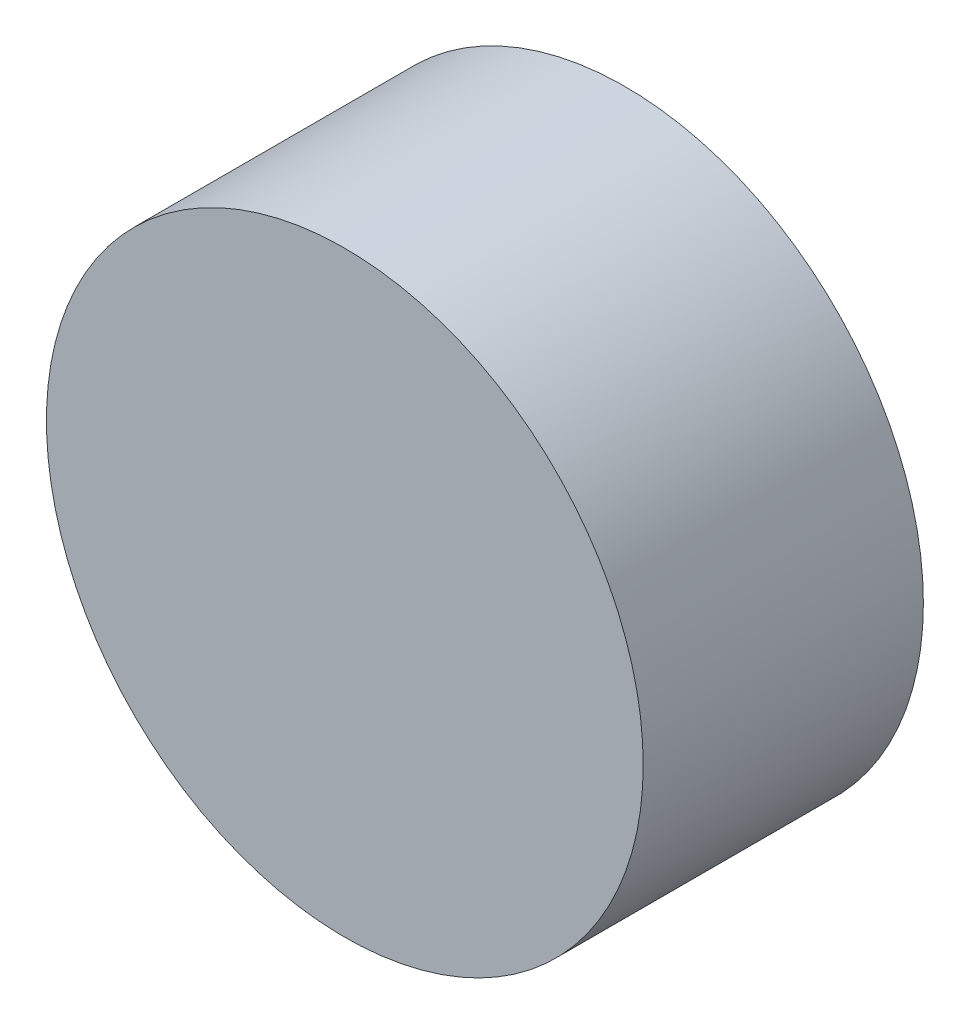
ISO-10303-21;
HEADER;
FILE_DESCRIPTION(('STEP AP214'),'2;1');
FILE_NAME('part.step','',(''),(''),'','','');
FILE_SCHEMA(('AUTOMOTIVE_DESIGN { 1 0 10303 214 1 1 1 1 }'));
ENDSEC;
DATA;
#1=APPLICATION_CONTEXT('core data for automotive mechanical design processes');
#2=APPLICATION_PROTOCOL_DEFINITION('international standard','automotive_design',2000,#1);
#3=PRODUCT_CONTEXT('',#1,'mechanical');
#4=PRODUCT('Part','Part','',(#3));
#5=PRODUCT_RELATED_PRODUCT_CATEGORY('part','',(#4));
#6=PRODUCT_DEFINITION_FORMATION('','',#4);
#7=PRODUCT_DEFINITION_CONTEXT('part definition',#1,'design');
#8=PRODUCT_DEFINITION('design','',#6,#7);
#9=PRODUCT_DEFINITION_SHAPE('','',#8);
#10=(LENGTH_UNIT() NAMED_UNIT(*) SI_UNIT(.MILLI.,.METRE.));
#11=(NAMED_UNIT(*) PLANE_ANGLE_UNIT() SI_UNIT($,.RADIAN.));
#12=(NAMED_UNIT(*) SI_UNIT($,.STERADIAN.) SOLID_ANGLE_UNIT());
#13=UNCERTAINTY_MEASURE_WITH_UNIT(LENGTH_MEASURE(1.E-05),#10,'distance_accuracy_value','');
#14=(GEOMETRIC_REPRESENTATION_CONTEXT(3) GLOBAL_UNCERTAINTY_ASSIGNED_CONTEXT((#13)) GLOBAL_UNIT_ASSIGNED_CONTEXT((#10,
#11,#12)) REPRESENTATION_CONTEXT('',''));
#15=CARTESIAN_POINT('',(0.,0.,0.));
#16=DIRECTION('',(0.,0.,1.));
#17=DIRECTION('',(1.,0.,0.));
#18=AXIS2_PLACEMENT_3D('',#15,#16,#17);
#19=CARTESIAN_POINT('',(0.,0.,48.75));
#20=DIRECTION('',(0.,0.,-1.));
#21=DIRECTION('',(-1.,0.,0.));
#22=AXIS2_PLACEMENT_3D('',#19,#20,#21);
#23=CYLINDRICAL_SURFACE('',#22,45.);
#24=CARTESIAN_POINT('',(0.,0.,6.5));
#25=DIRECTION('',(0.,0.,1.));
#26=DIRECTION('',(1.,0.,0.));
#27=AXIS2_PLACEMENT_3D('',#24,#25,#26);
#28=CIRCLE('',#27,45.);
#29=CARTESIAN_POINT('',(45.,0.,6.5));
#30=VERTEX_POINT('',#29);
#31=EDGE_CURVE('E69',#30,#30,#28,.T.);
#32=ORIENTED_EDGE('',*,*,#31,.T.);
#33=EDGE_LOOP('',(#32));
#34=FACE_BOUND('',#33,.T.);
#35=CARTESIAN_POINT('',(0.,0.,48.75));
#36=DIRECTION('',(0.,0.,1.));
#37=DIRECTION('',(1.,0.,0.));
#38=AXIS2_PLACEMENT_3D('',#35,#36,#37);
#39=CIRCLE('',#38,45.);
#40=CARTESIAN_POINT('',(45.,0.,48.75));
#41=VERTEX_POINT('',#40);
#42=EDGE_CURVE('E11',#41,#41,#39,.T.);
#43=ORIENTED_EDGE('',*,*,#42,.F.);
#44=EDGE_LOOP('',(#43));
#45=FACE_BOUND('',#44,.T.);
#46=ADVANCED_FACE('F63',(#34,#45),#23,.T.);
#47=CARTESIAN_POINT('',(0.,0.,48.75));
#48=DIRECTION('',(0.,0.,1.));
#49=DIRECTION('',(1.,0.,0.));
#50=AXIS2_PLACEMENT_3D('',#47,#48,#49);
#51=PLANE('',#50);
#52=ORIENTED_EDGE('',*,*,#42,.T.);
#53=EDGE_LOOP('',(#52));
#54=FACE_BOUND('',#53,.T.);
#55=ADVANCED_FACE('F134',(#54),#51,.T.);
#56=CARTESIAN_POINT('',(0.,0.,6.5));
#57=DIRECTION('',(0.,0.,-1.));
#58=DIRECTION('',(-1.,0.,0.));
#59=AXIS2_PLACEMENT_3D('',#56,#57,#58);
#60=CYLINDRICAL_SURFACE('',#59,31.5);
#61=CARTESIAN_POINT('',(0.,0.,6.5));
#62=DIRECTION('',(0.,0.,1.));
#63=DIRECTION('',(1.,0.,0.));
#64=AXIS2_PLACEMENT_3D('',#61,#62,#63);
#65=CIRCLE('',#64,31.5);
#66=CARTESIAN_POINT('',(-31.5,0.,6.5));
#67=VERTEX_POINT('',#66);
#68=EDGE_CURVE('E73',#67,#67,#65,.T.);
#69=CARTESIAN_POINT('',(0.,0.,0.));
#70=DIRECTION('',(0.,0.,1.));
#71=DIRECTION('',(1.,0.,0.));
#72=AXIS2_PLACEMENT_3D('',#69,#70,#71);
#73=CIRCLE('',#72,31.5);
#74=CARTESIAN_POINT('',(-31.5,0.,0.));
#75=VERTEX_POINT('',#74);
#76=EDGE_CURVE('E78',#75,#75,#73,.T.);
#77=CARTESIAN_POINT('',(-31.5,0.,6.5));
#78=CARTESIAN_POINT('',(-31.5,0.,6.43229166666667));
#79=CARTESIAN_POINT('',(-31.5,0.,6.36458333333333));
#80=CARTESIAN_POINT('',(-31.5,0.,6.22916666666667));
#81=CARTESIAN_POINT('',(-31.5,0.,6.16145833333333));
#82=CARTESIAN_POINT('',(-31.5,0.,6.02604166666667));
#83=CARTESIAN_POINT('',(-31.5,0.,5.95833333333333));
#84=CARTESIAN_POINT('',(-31.5,0.,5.82291666666667));
#85=CARTESIAN_POINT('',(-31.5,0.,5.75520833333333));
#86=CARTESIAN_POINT('',(-31.5,0.,5.61979166666667));
#87=CARTESIAN_POINT('',(-31.5,0.,5.55208333333333));
#88=CARTESIAN_POINT('',(-31.5,0.,5.41666666666667));
#89=CARTESIAN_POINT('',(-31.5,0.,5.34895833333333));
#90=CARTESIAN_POINT('',(-31.5,0.,5.21354166666667));
#91=CARTESIAN_POINT('',(-31.5,0.,5.14583333333333));
#92=CARTESIAN_POINT('',(-31.5,0.,5.01041666666667));
#93=CARTESIAN_POINT('',(-31.5,0.,4.94270833333333));
#94=CARTESIAN_POINT('',(-31.5,0.,4.80729166666667));
#95=CARTESIAN_POINT('',(-31.5,0.,4.73958333333333));
#96=CARTESIAN_POINT('',(-31.5,0.,4.60416666666667));
#97=CARTESIAN_POINT('',(-31.5,0.,4.53645833333333));
#98=CARTESIAN_POINT('',(-31.5,0.,4.40104166666667));
#99=CARTESIAN_POINT('',(-31.5,0.,4.33333333333333));
#100=CARTESIAN_POINT('',(-31.5,0.,4.19791666666667));
#101=CARTESIAN_POINT('',(-31.5,0.,4.13020833333333));
#102=CARTESIAN_POINT('',(-31.5,0.,3.99479166666667));
#103=CARTESIAN_POINT('',(-31.5,0.,3.92708333333333));
#104=CARTESIAN_POINT('',(-31.5,0.,3.79166666666667));
#105=CARTESIAN_POINT('',(-31.5,0.,3.72395833333333));
#106=CARTESIAN_POINT('',(-31.5,0.,3.58854166666667));
#107=CARTESIAN_POINT('',(-31.5,0.,3.52083333333333));
#108=CARTESIAN_POINT('',(-31.5,0.,3.38541666666667));
#109=CARTESIAN_POINT('',(-31.5,0.,3.31770833333333));
#110=CARTESIAN_POINT('',(-31.5,0.,3.18229166666667));
#111=CARTESIAN_POINT('',(-31.5,0.,3.11458333333333));
#112=CARTESIAN_POINT('',(-31.5,0.,2.97916666666667));
#113=CARTESIAN_POINT('',(-31.5,0.,2.91145833333333));
#114=CARTESIAN_POINT('',(-31.5,0.,2.77604166666667));
#115=CARTESIAN_POINT('',(-31.5,0.,2.70833333333333));
#116=CARTESIAN_POINT('',(-31.5,0.,2.57291666666667));
#117=CARTESIAN_POINT('',(-31.5,0.,2.50520833333333));
#118=CARTESIAN_POINT('',(-31.5,0.,2.36979166666667));
#119=CARTESIAN_POINT('',(-31.5,0.,2.30208333333333));
#120=CARTESIAN_POINT('',(-31.5,0.,2.16666666666667));
#121=CARTESIAN_POINT('',(-31.5,0.,2.09895833333333));
#122=CARTESIAN_POINT('',(-31.5,0.,1.96354166666667));
#123=CARTESIAN_POINT('',(-31.5,0.,1.89583333333333));
#124=CARTESIAN_POINT('',(-31.5,0.,1.76041666666667));
#125=CARTESIAN_POINT('',(-31.5,0.,1.69270833333333));
#126=CARTESIAN_POINT('',(-31.5,0.,1.55729166666667));
#127=CARTESIAN_POINT('',(-31.5,0.,1.48958333333333));
#128=CARTESIAN_POINT('',(-31.5,0.,1.35416666666667));
#129=CARTESIAN_POINT('',(-31.5,0.,1.28645833333333));
#130=CARTESIAN_POINT('',(-31.5,0.,1.15104166666667));
#131=CARTESIAN_POINT('',(-31.5,0.,1.08333333333333));
#132=CARTESIAN_POINT('',(-31.5,0.,0.947916666666667));
#133=CARTESIAN_POINT('',(-31.5,0.,0.880208333333333));
#134=CARTESIAN_POINT('',(-31.5,0.,0.744791666666667));
#135=CARTESIAN_POINT('',(-31.5,0.,0.677083333333333));
#136=CARTESIAN_POINT('',(-31.5,0.,0.541666666666667));
#137=CARTESIAN_POINT('',(-31.5,0.,0.473958333333333));
#138=CARTESIAN_POINT('',(-31.5,0.,0.338541666666667));
#139=CARTESIAN_POINT('',(-31.5,0.,0.270833333333334));
#140=CARTESIAN_POINT('',(-31.5,0.,0.135416666666667));
#141=CARTESIAN_POINT('',(-31.5,0.,0.0677083333333334));
#142=CARTESIAN_POINT('',(-31.5,0.,0.));
#143=B_SPLINE_CURVE_WITH_KNOTS('',3,(#77,#78,#79,#80,#81,#82,#83,#84,#85,#86,#87,#88,#89,#90,
#91,#92,#93,#94,#95,#96,#97,#98,#99,#100,#101,#102,#103,#104,#105,#106,#107,#108,#109,#110,#111,
#112,#113,#114,#115,#116,#117,#118,#119,#120,#121,#122,#123,#124,#125,#126,#127,#128,#129,#130,
#131,#132,#133,#134,#135,#136,#137,#138,#139,#140,#141,#142),.UNSPECIFIED.,.F.,.F.,(4,2,2,2,2,2,
2,2,2,2,2,2,2,2,2,2,2,2,2,2,2,2,2,2,2,2,2,2,2,2,2,2,4),(0.,0.203125,0.40625,0.609375000000001,
0.812500000000001,1.015625,1.21875,1.421875,1.625,1.828125,2.03125,2.234375,2.4375,2.640625,
2.84375,3.046875,3.25,3.453125,3.65625,3.859375,4.0625,4.265625,4.46875,4.671875,4.875,5.078125,
5.28125,5.484375,5.6875,5.890625,6.09375,6.296875,6.5),.UNSPECIFIED.);
#144=EDGE_CURVE('BSEAM139',#67,#75,#143,.T.);
#145=ORIENTED_EDGE('',*,*,#68,.F.);
#146=ORIENTED_EDGE('',*,*,#76,.T.);
#147=ORIENTED_EDGE('',*,*,#144,.T.);
#148=ORIENTED_EDGE('',*,*,#144,.F.);
#149=EDGE_LOOP('',(#145,#147,#146,#148));
#150=FACE_BOUND('',#149,.T.);
#151=ADVANCED_FACE('F139',(#150),#60,.T.);
#152=CARTESIAN_POINT('',(0.,0.,6.5));
#153=DIRECTION('',(0.,0.,1.));
#154=DIRECTION('',(1.,0.,0.));
#155=AXIS2_PLACEMENT_3D('',#152,#153,#154);
#156=PLANE('',#155);
#157=ORIENTED_EDGE('',*,*,#68,.T.);
#158=EDGE_LOOP('',(#157));
#159=FACE_BOUND('',#158,.T.);
#160=ORIENTED_EDGE('',*,*,#31,.F.);
#161=EDGE_LOOP('',(#160));
#162=FACE_BOUND('',#161,.T.);
#163=ADVANCED_FACE('F144',(#159,#162),#156,.F.);
#164=CARTESIAN_POINT('',(0.,0.,0.));
#165=DIRECTION('',(0.,0.,1.));
#166=DIRECTION('',(1.,0.,0.));
#167=AXIS2_PLACEMENT_3D('',#164,#165,#166);
#168=PLANE('',#167);
#169=CARTESIAN_POINT('',(-17.6776695296638,-17.6776695296635,0.));
#170=DIRECTION('',(0.,0.,1.));
#171=DIRECTION('',(1.,0.,0.));
#172=AXIS2_PLACEMENT_3D('',#169,#170,#171);
#173=CIRCLE('',#172,2.5);
#174=CARTESIAN_POINT('',(-20.1776695296638,-17.6776695296635,0.));
#175=VERTEX_POINT('',#174);
#176=EDGE_CURVE('E93',#175,#175,#173,.T.);
#177=ORIENTED_EDGE('',*,*,#176,.T.);
#178=EDGE_LOOP('',(#177));
#179=FACE_BOUND('',#178,.T.);
#180=CARTESIAN_POINT('',(17.6776695296636,-17.6776695296638,0.));
#181=DIRECTION('',(0.,0.,1.));
#182=DIRECTION('',(1.,0.,0.));
#183=AXIS2_PLACEMENT_3D('',#180,#181,#182);
#184=CIRCLE('',#183,2.5);
#185=CARTESIAN_POINT('',(15.1776695296636,-17.6776695296638,0.));
#186=VERTEX_POINT('',#185);
#187=EDGE_CURVE('E99',#186,#186,#184,.T.);
#188=ORIENTED_EDGE('',*,*,#187,.T.);
#189=EDGE_LOOP('',(#188));
#190=FACE_BOUND('',#189,.T.);
#191=CARTESIAN_POINT('',(17.6776695296637,17.6776695296637,0.));
#192=DIRECTION('',(0.,0.,1.));
#193=DIRECTION('',(1.,0.,0.));
#194=AXIS2_PLACEMENT_3D('',#191,#192,#193);
#195=CIRCLE('',#194,2.5);
#196=CARTESIAN_POINT('',(15.1776695296637,17.6776695296637,0.));
#197=VERTEX_POINT('',#196);
#198=EDGE_CURVE('E105',#197,#197,#195,.T.);
#199=ORIENTED_EDGE('',*,*,#198,.T.);
#200=EDGE_LOOP('',(#199));
#201=FACE_BOUND('',#200,.T.);
#202=CARTESIAN_POINT('',(-17.6776695296635,17.6776695296639,0.));
#203=DIRECTION('',(0.,0.,1.));
#204=DIRECTION('',(1.,0.,0.));
#205=AXIS2_PLACEMENT_3D('',#202,#203,#204);
#206=CIRCLE('',#205,2.5);
#207=CARTESIAN_POINT('',(-20.1776695296635,17.6776695296639,0.));
#208=VERTEX_POINT('',#207);
#209=EDGE_CURVE('E111',#208,#208,#206,.T.);
#210=ORIENTED_EDGE('',*,*,#209,.T.);
#211=EDGE_LOOP('',(#210));
#212=FACE_BOUND('',#211,.T.);
#213=CARTESIAN_POINT('',(0.,0.,0.));
#214=DIRECTION('',(0.,0.,1.));
#215=DIRECTION('',(1.,0.,0.));
#216=AXIS2_PLACEMENT_3D('',#213,#214,#215);
#217=CIRCLE('',#216,15.75);
#218=CARTESIAN_POINT('',(-15.75,0.,0.));
#219=VERTEX_POINT('',#218);
#220=EDGE_CURVE('E86',#219,#219,#217,.T.);
#221=ORIENTED_EDGE('',*,*,#220,.T.);
#222=EDGE_LOOP('',(#221));
#223=FACE_BOUND('',#222,.T.);
#224=ORIENTED_EDGE('',*,*,#76,.F.);
#225=EDGE_LOOP('',(#224));
#226=FACE_BOUND('',#225,.T.);
#227=ADVANCED_FACE('F148',(#179,#190,#201,#212,#223,#226),#168,.F.);
#228=CARTESIAN_POINT('',(0.,0.,6.2));
#229=DIRECTION('',(0.,0.,-1.));
#230=DIRECTION('',(-1.,0.,0.));
#231=AXIS2_PLACEMENT_3D('',#228,#229,#230);
#232=CYLINDRICAL_SURFACE('',#231,15.75);
#233=CARTESIAN_POINT('',(0.,0.,6.2));
#234=DIRECTION('',(0.,0.,1.));
#235=DIRECTION('',(1.,0.,0.));
#236=AXIS2_PLACEMENT_3D('',#233,#234,#235);
#237=CIRCLE('',#236,15.75);
#238=CARTESIAN_POINT('',(-15.75,0.,6.2));
#239=VERTEX_POINT('',#238);
#240=EDGE_CURVE('E82',#239,#239,#237,.T.);
#241=CARTESIAN_POINT('',(-15.75,0.,6.2));
#242=CARTESIAN_POINT('',(-15.75,0.,6.13541666666667));
#243=CARTESIAN_POINT('',(-15.75,0.,6.07083333333333));
#244=CARTESIAN_POINT('',(-15.75,0.,5.94166666666667));
#245=CARTESIAN_POINT('',(-15.75,0.,5.87708333333333));
#246=CARTESIAN_POINT('',(-15.75,0.,5.74791666666667));
#247=CARTESIAN_POINT('',(-15.75,0.,5.68333333333333));
#248=CARTESIAN_POINT('',(-15.75,0.,5.55416666666667));
#249=CARTESIAN_POINT('',(-15.75,0.,5.48958333333333));
#250=CARTESIAN_POINT('',(-15.75,0.,5.36041666666667));
#251=CARTESIAN_POINT('',(-15.75,0.,5.29583333333333));
#252=CARTESIAN_POINT('',(-15.75,0.,5.16666666666667));
#253=CARTESIAN_POINT('',(-15.75,0.,5.10208333333333));
#254=CARTESIAN_POINT('',(-15.75,0.,4.97291666666667));
#255=CARTESIAN_POINT('',(-15.75,0.,4.90833333333333));
#256=CARTESIAN_POINT('',(-15.75,0.,4.77916666666667));
#257=CARTESIAN_POINT('',(-15.75,0.,4.71458333333333));
#258=CARTESIAN_POINT('',(-15.75,0.,4.58541666666667));
#259=CARTESIAN_POINT('',(-15.75,0.,4.52083333333333));
#260=CARTESIAN_POINT('',(-15.75,0.,4.39166666666667));
#261=CARTESIAN_POINT('',(-15.75,0.,4.32708333333333));
#262=CARTESIAN_POINT('',(-15.75,0.,4.19791666666667));
#263=CARTESIAN_POINT('',(-15.75,0.,4.13333333333333));
#264=CARTESIAN_POINT('',(-15.75,0.,4.00416666666667));
#265=CARTESIAN_POINT('',(-15.75,0.,3.93958333333333));
#266=CARTESIAN_POINT('',(-15.75,0.,3.81041666666667));
#267=CARTESIAN_POINT('',(-15.75,0.,3.74583333333333));
#268=CARTESIAN_POINT('',(-15.75,0.,3.61666666666667));
#269=CARTESIAN_POINT('',(-15.75,0.,3.55208333333333));
#270=CARTESIAN_POINT('',(-15.75,0.,3.42291666666667));
#271=CARTESIAN_POINT('',(-15.75,0.,3.35833333333333));
#272=CARTESIAN_POINT('',(-15.75,0.,3.22916666666667));
#273=CARTESIAN_POINT('',(-15.75,0.,3.16458333333333));
#274=CARTESIAN_POINT('',(-15.75,0.,3.03541666666667));
#275=CARTESIAN_POINT('',(-15.75,0.,2.97083333333333));
#276=CARTESIAN_POINT('',(-15.75,0.,2.84166666666667));
#277=CARTESIAN_POINT('',(-15.75,0.,2.77708333333333));
#278=CARTESIAN_POINT('',(-15.75,0.,2.64791666666667));
#279=CARTESIAN_POINT('',(-15.75,0.,2.58333333333333));
#280=CARTESIAN_POINT('',(-15.75,0.,2.45416666666667));
#281=CARTESIAN_POINT('',(-15.75,0.,2.38958333333333));
#282=CARTESIAN_POINT('',(-15.75,0.,2.26041666666667));
#283=CARTESIAN_POINT('',(-15.75,0.,2.19583333333333));
#284=CARTESIAN_POINT('',(-15.75,0.,2.06666666666667));
#285=CARTESIAN_POINT('',(-15.75,0.,2.00208333333333));
#286=CARTESIAN_POINT('',(-15.75,0.,1.87291666666667));
#287=CARTESIAN_POINT('',(-15.75,0.,1.80833333333333));
#288=CARTESIAN_POINT('',(-15.75,0.,1.67916666666667));
#289=CARTESIAN_POINT('',(-15.75,0.,1.61458333333333));
#290=CARTESIAN_POINT('',(-15.75,0.,1.48541666666667));
#291=CARTESIAN_POINT('',(-15.75,0.,1.42083333333333));
#292=CARTESIAN_POINT('',(-15.75,0.,1.29166666666667));
#293=CARTESIAN_POINT('',(-15.75,0.,1.22708333333333));
#294=CARTESIAN_POINT('',(-15.75,0.,1.09791666666667));
#295=CARTESIAN_POINT('',(-15.75,0.,1.03333333333333));
#296=CARTESIAN_POINT('',(-15.75,0.,0.904166666666667));
#297=CARTESIAN_POINT('',(-15.75,0.,0.839583333333333));
#298=CARTESIAN_POINT('',(-15.75,0.,0.710416666666666));
#299=CARTESIAN_POINT('',(-15.75,0.,0.645833333333333));
#300=CARTESIAN_POINT('',(-15.75,0.,0.516666666666667));
#301=CARTESIAN_POINT('',(-15.75,0.,0.452083333333333));
#302=CARTESIAN_POINT('',(-15.75,0.,0.322916666666667));
#303=CARTESIAN_POINT('',(-15.75,0.,0.258333333333334));
#304=CARTESIAN_POINT('',(-15.75,0.,0.129166666666667));
#305=CARTESIAN_POINT('',(-15.75,0.,0.0645833333333335));
#306=CARTESIAN_POINT('',(-15.75,0.,0.));
#307=B_SPLINE_CURVE_WITH_KNOTS('',3,(#241,#242,#243,#244,#245,#246,#247,#248,#249,#250,#251,
#252,#253,#254,#255,#256,#257,#258,#259,#260,#261,#262,#263,#264,#265,#266,#267,#268,#269,#270,
#271,#272,#273,#274,#275,#276,#277,#278,#279,#280,#281,#282,#283,#284,#285,#286,#287,#288,#289,
#290,#291,#292,#293,#294,#295,#296,#297,#298,#299,#300,#301,#302,#303,#304,#305,#306),
.UNSPECIFIED.,.F.,.F.,(4,2,2,2,2,2,2,2,2,2,2,2,2,2,2,2,2,2,2,2,2,2,2,2,2,2,2,2,2,2,2,2,4),(0.,
0.193749999999999,0.3875,0.581249999999999,0.775,0.968749999999999,1.1625,1.35625,1.55,1.74375,
1.9375,2.13125,2.325,2.51875,2.7125,2.90625,3.1,3.29375,3.4875,3.68125,3.875,4.06875,4.2625,
4.45625,4.65,4.84375,5.0375,5.23125,5.425,5.61875,5.8125,6.00625,6.2),.UNSPECIFIED.);
#308=EDGE_CURVE('BSEAM150',#239,#219,#307,.T.);
#309=ORIENTED_EDGE('',*,*,#240,.T.);
#310=ORIENTED_EDGE('',*,*,#220,.F.);
#311=ORIENTED_EDGE('',*,*,#308,.T.);
#312=ORIENTED_EDGE('',*,*,#308,.F.);
#313=EDGE_LOOP('',(#309,#311,#310,#312));
#314=FACE_BOUND('',#313,.T.);
#315=ADVANCED_FACE('F150',(#314),#232,.F.);
#316=CARTESIAN_POINT('',(0.,0.,6.2));
#317=DIRECTION('',(0.,0.,1.));
#318=DIRECTION('',(1.,0.,0.));
#319=AXIS2_PLACEMENT_3D('',#316,#317,#318);
#320=PLANE('',#319);
#321=ORIENTED_EDGE('',*,*,#240,.F.);
#322=EDGE_LOOP('',(#321));
#323=FACE_BOUND('',#322,.T.);
#324=ADVANCED_FACE('F131',(#323),#320,.F.);
#325=CARTESIAN_POINT('',(-17.6776695296635,17.6776695296639,6.2));
#326=DIRECTION('',(0.,0.,-1.));
#327=DIRECTION('',(-1.,0.,0.));
#328=AXIS2_PLACEMENT_3D('',#325,#326,#327);
#329=CYLINDRICAL_SURFACE('',#328,2.5);
#330=CARTESIAN_POINT('',(-17.6776695296635,17.6776695296639,6.2));
#331=DIRECTION('',(0.,0.,1.));
#332=DIRECTION('',(1.,0.,0.));
#333=AXIS2_PLACEMENT_3D('',#330,#331,#332);
#334=CIRCLE('',#333,2.5);
#335=CARTESIAN_POINT('',(-20.1776695296635,17.6776695296639,6.2));
#336=VERTEX_POINT('',#335);
#337=EDGE_CURVE('E91',#336,#336,#334,.T.);
#338=CARTESIAN_POINT('',(-20.1776695296635,17.6776695296639,6.2));
#339=CARTESIAN_POINT('',(-20.1776695296635,17.6776695296639,6.13541666666667));
#340=CARTESIAN_POINT('',(-20.1776695296635,17.6776695296639,6.07083333333333));
#341=CARTESIAN_POINT('',(-20.1776695296635,17.6776695296639,5.94166666666667));
#342=CARTESIAN_POINT('',(-20.1776695296635,17.6776695296639,5.87708333333333));
#343=CARTESIAN_POINT('',(-20.1776695296635,17.6776695296639,5.74791666666667));
#344=CARTESIAN_POINT('',(-20.1776695296635,17.6776695296639,5.68333333333333));
#345=CARTESIAN_POINT('',(-20.1776695296635,17.6776695296639,5.55416666666667));
#346=CARTESIAN_POINT('',(-20.1776695296635,17.6776695296639,5.48958333333333));
#347=CARTESIAN_POINT('',(-20.1776695296635,17.6776695296639,5.36041666666667));
#348=CARTESIAN_POINT('',(-20.1776695296635,17.6776695296639,5.29583333333333));
#349=CARTESIAN_POINT('',(-20.1776695296635,17.6776695296639,5.16666666666667));
#350=CARTESIAN_POINT('',(-20.1776695296635,17.6776695296639,5.10208333333333));
#351=CARTESIAN_POINT('',(-20.1776695296635,17.6776695296639,4.97291666666667));
#352=CARTESIAN_POINT('',(-20.1776695296635,17.6776695296639,4.90833333333333));
#353=CARTESIAN_POINT('',(-20.1776695296635,17.6776695296639,4.77916666666667));
#354=CARTESIAN_POINT('',(-20.1776695296635,17.6776695296639,4.71458333333333));
#355=CARTESIAN_POINT('',(-20.1776695296635,17.6776695296639,4.58541666666667));
#356=CARTESIAN_POINT('',(-20.1776695296635,17.6776695296639,4.52083333333333));
#357=CARTESIAN_POINT('',(-20.1776695296635,17.6776695296639,4.39166666666667));
#358=CARTESIAN_POINT('',(-20.1776695296635,17.6776695296639,4.32708333333333));
#359=CARTESIAN_POINT('',(-20.1776695296635,17.6776695296639,4.19791666666667));
#360=CARTESIAN_POINT('',(-20.1776695296635,17.6776695296639,4.13333333333333));
#361=CARTESIAN_POINT('',(-20.1776695296635,17.6776695296639,4.00416666666667));
#362=CARTESIAN_POINT('',(-20.1776695296635,17.6776695296639,3.93958333333333));
#363=CARTESIAN_POINT('',(-20.1776695296635,17.6776695296639,3.81041666666667));
#364=CARTESIAN_POINT('',(-20.1776695296635,17.6776695296639,3.74583333333333));
#365=CARTESIAN_POINT('',(-20.1776695296635,17.6776695296639,3.61666666666667));
#366=CARTESIAN_POINT('',(-20.1776695296635,17.6776695296639,3.55208333333333));
#367=CARTESIAN_POINT('',(-20.1776695296635,17.6776695296639,3.42291666666667));
#368=CARTESIAN_POINT('',(-20.1776695296635,17.6776695296639,3.35833333333333));
#369=CARTESIAN_POINT('',(-20.1776695296635,17.6776695296639,3.22916666666667));
#370=CARTESIAN_POINT('',(-20.1776695296635,17.6776695296639,3.16458333333333));
#371=CARTESIAN_POINT('',(-20.1776695296635,17.6776695296639,3.03541666666667));
#372=CARTESIAN_POINT('',(-20.1776695296635,17.6776695296639,2.97083333333333));
#373=CARTESIAN_POINT('',(-20.1776695296635,17.6776695296639,2.84166666666667));
#374=CARTESIAN_POINT('',(-20.1776695296635,17.6776695296639,2.77708333333333));
#375=CARTESIAN_POINT('',(-20.1776695296635,17.6776695296639,2.64791666666667));
#376=CARTESIAN_POINT('',(-20.1776695296635,17.6776695296639,2.58333333333333));
#377=CARTESIAN_POINT('',(-20.1776695296635,17.6776695296639,2.45416666666667));
#378=CARTESIAN_POINT('',(-20.1776695296635,17.6776695296639,2.38958333333333));
#379=CARTESIAN_POINT('',(-20.1776695296635,17.6776695296639,2.26041666666667));
#380=CARTESIAN_POINT('',(-20.1776695296635,17.6776695296639,2.19583333333333));
#381=CARTESIAN_POINT('',(-20.1776695296635,17.6776695296639,2.06666666666667));
#382=CARTESIAN_POINT('',(-20.1776695296635,17.6776695296639,2.00208333333333));
#383=CARTESIAN_POINT('',(-20.1776695296635,17.6776695296639,1.87291666666667));
#384=CARTESIAN_POINT('',(-20.1776695296635,17.6776695296639,1.80833333333333));
#385=CARTESIAN_POINT('',(-20.1776695296635,17.6776695296639,1.67916666666667));
#386=CARTESIAN_POINT('',(-20.1776695296635,17.6776695296639,1.61458333333333));
#387=CARTESIAN_POINT('',(-20.1776695296635,17.6776695296639,1.48541666666667));
#388=CARTESIAN_POINT('',(-20.1776695296635,17.6776695296639,1.42083333333333));
#389=CARTESIAN_POINT('',(-20.1776695296635,17.6776695296639,1.29166666666667));
#390=CARTESIAN_POINT('',(-20.1776695296635,17.6776695296639,1.22708333333333));
#391=CARTESIAN_POINT('',(-20.1776695296635,17.6776695296639,1.09791666666667));
#392=CARTESIAN_POINT('',(-20.1776695296635,17.6776695296639,1.03333333333333));
#393=CARTESIAN_POINT('',(-20.1776695296635,17.6776695296639,0.904166666666667));
#394=CARTESIAN_POINT('',(-20.1776695296635,17.6776695296639,0.839583333333333));
#395=CARTESIAN_POINT('',(-20.1776695296635,17.6776695296639,0.710416666666666));
#396=CARTESIAN_POINT('',(-20.1776695296635,17.6776695296639,0.645833333333333));
#397=CARTESIAN_POINT('',(-20.1776695296635,17.6776695296639,0.516666666666667));
#398=CARTESIAN_POINT('',(-20.1776695296635,17.6776695296639,0.452083333333333));
#399=CARTESIAN_POINT('',(-20.1776695296635,17.6776695296639,0.322916666666667));
#400=CARTESIAN_POINT('',(-20.1776695296635,17.6776695296639,0.258333333333334));
#401=CARTESIAN_POINT('',(-20.1776695296635,17.6776695296639,0.129166666666667));
#402=CARTESIAN_POINT('',(-20.1776695296635,17.6776695296639,0.0645833333333335));
#403=CARTESIAN_POINT('',(-20.1776695296635,17.6776695296639,0.));
#404=B_SPLINE_CURVE_WITH_KNOTS('',3,(#338,#339,#340,#341,#342,#343,#344,#345,#346,#347,#348,
#349,#350,#351,#352,#353,#354,#355,#356,#357,#358,#359,#360,#361,#362,#363,#364,#365,#366,#367,
#368,#369,#370,#371,#372,#373,#374,#375,#376,#377,#378,#379,#380,#381,#382,#383,#384,#385,#386,
#387,#388,#389,#390,#391,#392,#393,#394,#395,#396,#397,#398,#399,#400,#401,#402,#403),
.UNSPECIFIED.,.F.,.F.,(4,2,2,2,2,2,2,2,2,2,2,2,2,2,2,2,2,2,2,2,2,2,2,2,2,2,2,2,2,2,2,2,4),(0.,
0.193749999999999,0.3875,0.581249999999999,0.775,0.968749999999999,1.1625,1.35625,1.55,1.74375,
1.9375,2.13125,2.325,2.51875,2.7125,2.90625,3.1,3.29375,3.4875,3.68125,3.875,4.06875,4.2625,
4.45625,4.65,4.84375,5.0375,5.23125,5.425,5.61875,5.8125,6.00625,6.2),.UNSPECIFIED.);
#405=EDGE_CURVE('BSEAM117',#336,#208,#404,.T.);
#406=ORIENTED_EDGE('',*,*,#337,.T.);
#407=ORIENTED_EDGE('',*,*,#209,.F.);
#408=ORIENTED_EDGE('',*,*,#405,.T.);
#409=ORIENTED_EDGE('',*,*,#405,.F.);
#410=EDGE_LOOP('',(#406,#408,#407,#409));
#411=FACE_BOUND('',#410,.T.);
#412=ADVANCED_FACE('F117',(#411),#329,.F.);
#413=CARTESIAN_POINT('',(0.,0.,6.2));
#414=DIRECTION('',(0.,0.,1.));
#415=DIRECTION('',(1.,0.,0.));
#416=AXIS2_PLACEMENT_3D('',#413,#414,#415);
#417=PLANE('',#416);
#418=ORIENTED_EDGE('',*,*,#337,.F.);
#419=EDGE_LOOP('',(#418));
#420=FACE_BOUND('',#419,.T.);
#421=ADVANCED_FACE('F120',(#420),#417,.F.);
#422=CARTESIAN_POINT('',(17.6776695296637,17.6776695296637,6.2));
#423=DIRECTION('',(0.,0.,-1.));
#424=DIRECTION('',(-1.,0.,0.));
#425=AXIS2_PLACEMENT_3D('',#422,#423,#424);
#426=CYLINDRICAL_SURFACE('',#425,2.5);
#427=CARTESIAN_POINT('',(17.6776695296637,17.6776695296637,6.2));
#428=DIRECTION('',(0.,0.,1.));
#429=DIRECTION('',(1.,0.,0.));
#430=AXIS2_PLACEMENT_3D('',#427,#428,#429);
#431=CIRCLE('',#430,2.5);
#432=CARTESIAN_POINT('',(15.1776695296637,17.6776695296637,6.2));
#433=VERTEX_POINT('',#432);
#434=EDGE_CURVE('E108',#433,#433,#431,.T.);
#435=CARTESIAN_POINT('',(15.1776695296637,17.6776695296637,6.2));
#436=CARTESIAN_POINT('',(15.1776695296637,17.6776695296637,6.13541666666667));
#437=CARTESIAN_POINT('',(15.1776695296637,17.6776695296637,6.07083333333333));
#438=CARTESIAN_POINT('',(15.1776695296637,17.6776695296637,5.94166666666667));
#439=CARTESIAN_POINT('',(15.1776695296637,17.6776695296637,5.87708333333333));
#440=CARTESIAN_POINT('',(15.1776695296637,17.6776695296637,5.74791666666667));
#441=CARTESIAN_POINT('',(15.1776695296637,17.6776695296637,5.68333333333333));
#442=CARTESIAN_POINT('',(15.1776695296637,17.6776695296637,5.55416666666667));
#443=CARTESIAN_POINT('',(15.1776695296637,17.6776695296637,5.48958333333333));
#444=CARTESIAN_POINT('',(15.1776695296637,17.6776695296637,5.36041666666667));
#445=CARTESIAN_POINT('',(15.1776695296637,17.6776695296637,5.29583333333333));
#446=CARTESIAN_POINT('',(15.1776695296637,17.6776695296637,5.16666666666667));
#447=CARTESIAN_POINT('',(15.1776695296637,17.6776695296637,5.10208333333333));
#448=CARTESIAN_POINT('',(15.1776695296637,17.6776695296637,4.97291666666667));
#449=CARTESIAN_POINT('',(15.1776695296637,17.6776695296637,4.90833333333333));
#450=CARTESIAN_POINT('',(15.1776695296637,17.6776695296637,4.77916666666667));
#451=CARTESIAN_POINT('',(15.1776695296637,17.6776695296637,4.71458333333333));
#452=CARTESIAN_POINT('',(15.1776695296637,17.6776695296637,4.58541666666667));
#453=CARTESIAN_POINT('',(15.1776695296637,17.6776695296637,4.52083333333333));
#454=CARTESIAN_POINT('',(15.1776695296637,17.6776695296637,4.39166666666667));
#455=CARTESIAN_POINT('',(15.1776695296637,17.6776695296637,4.32708333333333));
#456=CARTESIAN_POINT('',(15.1776695296637,17.6776695296637,4.19791666666667));
#457=CARTESIAN_POINT('',(15.1776695296637,17.6776695296637,4.13333333333333));
#458=CARTESIAN_POINT('',(15.1776695296637,17.6776695296637,4.00416666666667));
#459=CARTESIAN_POINT('',(15.1776695296637,17.6776695296637,3.93958333333333));
#460=CARTESIAN_POINT('',(15.1776695296637,17.6776695296637,3.81041666666667));
#461=CARTESIAN_POINT('',(15.1776695296637,17.6776695296637,3.74583333333333));
#462=CARTESIAN_POINT('',(15.1776695296637,17.6776695296637,3.61666666666667));
#463=CARTESIAN_POINT('',(15.1776695296637,17.6776695296637,3.55208333333333));
#464=CARTESIAN_POINT('',(15.1776695296637,17.6776695296637,3.42291666666667));
#465=CARTESIAN_POINT('',(15.1776695296637,17.6776695296637,3.35833333333333));
#466=CARTESIAN_POINT('',(15.1776695296637,17.6776695296637,3.22916666666667));
#467=CARTESIAN_POINT('',(15.1776695296637,17.6776695296637,3.16458333333333));
#468=CARTESIAN_POINT('',(15.1776695296637,17.6776695296637,3.03541666666667));
#469=CARTESIAN_POINT('',(15.1776695296637,17.6776695296637,2.97083333333333));
#470=CARTESIAN_POINT('',(15.1776695296637,17.6776695296637,2.84166666666667));
#471=CARTESIAN_POINT('',(15.1776695296637,17.6776695296637,2.77708333333333));
#472=CARTESIAN_POINT('',(15.1776695296637,17.6776695296637,2.64791666666667));
#473=CARTESIAN_POINT('',(15.1776695296637,17.6776695296637,2.58333333333333));
#474=CARTESIAN_POINT('',(15.1776695296637,17.6776695296637,2.45416666666667));
#475=CARTESIAN_POINT('',(15.1776695296637,17.6776695296637,2.38958333333333));
#476=CARTESIAN_POINT('',(15.1776695296637,17.6776695296637,2.26041666666667));
#477=CARTESIAN_POINT('',(15.1776695296637,17.6776695296637,2.19583333333333));
#478=CARTESIAN_POINT('',(15.1776695296637,17.6776695296637,2.06666666666667));
#479=CARTESIAN_POINT('',(15.1776695296637,17.6776695296637,2.00208333333333));
#480=CARTESIAN_POINT('',(15.1776695296637,17.6776695296637,1.87291666666667));
#481=CARTESIAN_POINT('',(15.1776695296637,17.6776695296637,1.80833333333333));
#482=CARTESIAN_POINT('',(15.1776695296637,17.6776695296637,1.67916666666667));
#483=CARTESIAN_POINT('',(15.1776695296637,17.6776695296637,1.61458333333333));
#484=CARTESIAN_POINT('',(15.1776695296637,17.6776695296637,1.48541666666667));
#485=CARTESIAN_POINT('',(15.1776695296637,17.6776695296637,1.42083333333333));
#486=CARTESIAN_POINT('',(15.1776695296637,17.6776695296637,1.29166666666667));
#487=CARTESIAN_POINT('',(15.1776695296637,17.6776695296637,1.22708333333333));
#488=CARTESIAN_POINT('',(15.1776695296637,17.6776695296637,1.09791666666667));
#489=CARTESIAN_POINT('',(15.1776695296637,17.6776695296637,1.03333333333333));
#490=CARTESIAN_POINT('',(15.1776695296637,17.6776695296637,0.904166666666667));
#491=CARTESIAN_POINT('',(15.1776695296637,17.6776695296637,0.839583333333333));
#492=CARTESIAN_POINT('',(15.1776695296637,17.6776695296637,0.710416666666666));
#493=CARTESIAN_POINT('',(15.1776695296637,17.6776695296637,0.645833333333333));
#494=CARTESIAN_POINT('',(15.1776695296637,17.6776695296637,0.516666666666667));
#495=CARTESIAN_POINT('',(15.1776695296637,17.6776695296637,0.452083333333333));
#496=CARTESIAN_POINT('',(15.1776695296637,17.6776695296637,0.322916666666667));
#497=CARTESIAN_POINT('',(15.1776695296637,17.6776695296637,0.258333333333334));
#498=CARTESIAN_POINT('',(15.1776695296637,17.6776695296637,0.129166666666667));
#499=CARTESIAN_POINT('',(15.1776695296637,17.6776695296637,0.0645833333333335));
#500=CARTESIAN_POINT('',(15.1776695296637,17.6776695296637,0.));
#501=B_SPLINE_CURVE_WITH_KNOTS('',3,(#435,#436,#437,#438,#439,#440,#441,#442,#443,#444,#445,
#446,#447,#448,#449,#450,#451,#452,#453,#454,#455,#456,#457,#458,#459,#460,#461,#462,#463,#464,
#465,#466,#467,#468,#469,#470,#471,#472,#473,#474,#475,#476,#477,#478,#479,#480,#481,#482,#483,
#484,#485,#486,#487,#488,#489,#490,#491,#492,#493,#494,#495,#496,#497,#498,#499,#500),
.UNSPECIFIED.,.F.,.F.,(4,2,2,2,2,2,2,2,2,2,2,2,2,2,2,2,2,2,2,2,2,2,2,2,2,2,2,2,2,2,2,2,4),(0.,
0.193749999999999,0.3875,0.581249999999999,0.775,0.968749999999999,1.1625,1.35625,1.55,1.74375,
1.9375,2.13125,2.325,2.51875,2.7125,2.90625,3.1,3.29375,3.4875,3.68125,3.875,4.06875,4.2625,
4.45625,4.65,4.84375,5.0375,5.23125,5.425,5.61875,5.8125,6.00625,6.2),.UNSPECIFIED.);
#502=EDGE_CURVE('BSEAM122',#433,#197,#501,.T.);
#503=ORIENTED_EDGE('',*,*,#434,.T.);
#504=ORIENTED_EDGE('',*,*,#198,.F.);
#505=ORIENTED_EDGE('',*,*,#502,.T.);
#506=ORIENTED_EDGE('',*,*,#502,.F.);
#507=EDGE_LOOP('',(#503,#505,#504,#506));
#508=FACE_BOUND('',#507,.T.);
#509=ADVANCED_FACE('F122',(#508),#426,.F.);
#510=CARTESIAN_POINT('',(0.,0.,6.2));
#511=DIRECTION('',(0.,0.,1.));
#512=DIRECTION('',(1.,0.,0.));
#513=AXIS2_PLACEMENT_3D('',#510,#511,#512);
#514=PLANE('',#513);
#515=ORIENTED_EDGE('',*,*,#434,.F.);
#516=EDGE_LOOP('',(#515));
#517=FACE_BOUND('',#516,.T.);
#518=ADVANCED_FACE('F128',(#517),#514,.F.);
#519=CARTESIAN_POINT('',(17.6776695296636,-17.6776695296638,6.2));
#520=DIRECTION('',(0.,0.,-1.));
#521=DIRECTION('',(-1.,0.,0.));
#522=AXIS2_PLACEMENT_3D('',#519,#520,#521);
#523=CYLINDRICAL_SURFACE('',#522,2.5);
#524=CARTESIAN_POINT('',(17.6776695296636,-17.6776695296638,6.2));
#525=DIRECTION('',(0.,0.,1.));
#526=DIRECTION('',(1.,0.,0.));
#527=AXIS2_PLACEMENT_3D('',#524,#525,#526);
#528=CIRCLE('',#527,2.5);
#529=CARTESIAN_POINT('',(15.1776695296636,-17.6776695296638,6.2));
#530=VERTEX_POINT('',#529);
#531=EDGE_CURVE('E102',#530,#530,#528,.T.);
#532=CARTESIAN_POINT('',(15.1776695296636,-17.6776695296638,6.2));
#533=CARTESIAN_POINT('',(15.1776695296636,-17.6776695296638,6.13541666666667));
#534=CARTESIAN_POINT('',(15.1776695296636,-17.6776695296638,6.07083333333333));
#535=CARTESIAN_POINT('',(15.1776695296636,-17.6776695296638,5.94166666666667));
#536=CARTESIAN_POINT('',(15.1776695296636,-17.6776695296638,5.87708333333333));
#537=CARTESIAN_POINT('',(15.1776695296636,-17.6776695296638,5.74791666666667));
#538=CARTESIAN_POINT('',(15.1776695296636,-17.6776695296638,5.68333333333333));
#539=CARTESIAN_POINT('',(15.1776695296636,-17.6776695296638,5.55416666666667));
#540=CARTESIAN_POINT('',(15.1776695296636,-17.6776695296638,5.48958333333333));
#541=CARTESIAN_POINT('',(15.1776695296636,-17.6776695296638,5.36041666666667));
#542=CARTESIAN_POINT('',(15.1776695296636,-17.6776695296638,5.29583333333333));
#543=CARTESIAN_POINT('',(15.1776695296636,-17.6776695296638,5.16666666666667));
#544=CARTESIAN_POINT('',(15.1776695296636,-17.6776695296638,5.10208333333333));
#545=CARTESIAN_POINT('',(15.1776695296636,-17.6776695296638,4.97291666666667));
#546=CARTESIAN_POINT('',(15.1776695296636,-17.6776695296638,4.90833333333333));
#547=CARTESIAN_POINT('',(15.1776695296636,-17.6776695296638,4.77916666666667));
#548=CARTESIAN_POINT('',(15.1776695296636,-17.6776695296638,4.71458333333333));
#549=CARTESIAN_POINT('',(15.1776695296636,-17.6776695296638,4.58541666666667));
#550=CARTESIAN_POINT('',(15.1776695296636,-17.6776695296638,4.52083333333333));
#551=CARTESIAN_POINT('',(15.1776695296636,-17.6776695296638,4.39166666666667));
#552=CARTESIAN_POINT('',(15.1776695296636,-17.6776695296638,4.32708333333333));
#553=CARTESIAN_POINT('',(15.1776695296636,-17.6776695296638,4.19791666666667));
#554=CARTESIAN_POINT('',(15.1776695296636,-17.6776695296638,4.13333333333333));
#555=CARTESIAN_POINT('',(15.1776695296636,-17.6776695296638,4.00416666666667));
#556=CARTESIAN_POINT('',(15.1776695296636,-17.6776695296638,3.93958333333333));
#557=CARTESIAN_POINT('',(15.1776695296636,-17.6776695296638,3.81041666666667));
#558=CARTESIAN_POINT('',(15.1776695296636,-17.6776695296638,3.74583333333333));
#559=CARTESIAN_POINT('',(15.1776695296636,-17.6776695296638,3.61666666666667));
#560=CARTESIAN_POINT('',(15.1776695296636,-17.6776695296638,3.55208333333333));
#561=CARTESIAN_POINT('',(15.1776695296636,-17.6776695296638,3.42291666666667));
#562=CARTESIAN_POINT('',(15.1776695296636,-17.6776695296638,3.35833333333333));
#563=CARTESIAN_POINT('',(15.1776695296636,-17.6776695296638,3.22916666666667));
#564=CARTESIAN_POINT('',(15.1776695296636,-17.6776695296638,3.16458333333333));
#565=CARTESIAN_POINT('',(15.1776695296636,-17.6776695296638,3.03541666666667));
#566=CARTESIAN_POINT('',(15.1776695296636,-17.6776695296638,2.97083333333333));
#567=CARTESIAN_POINT('',(15.1776695296636,-17.6776695296638,2.84166666666667));
#568=CARTESIAN_POINT('',(15.1776695296636,-17.6776695296638,2.77708333333333));
#569=CARTESIAN_POINT('',(15.1776695296636,-17.6776695296638,2.64791666666667));
#570=CARTESIAN_POINT('',(15.1776695296636,-17.6776695296638,2.58333333333333));
#571=CARTESIAN_POINT('',(15.1776695296636,-17.6776695296638,2.45416666666667));
#572=CARTESIAN_POINT('',(15.1776695296636,-17.6776695296638,2.38958333333333));
#573=CARTESIAN_POINT('',(15.1776695296636,-17.6776695296638,2.26041666666667));
#574=CARTESIAN_POINT('',(15.1776695296636,-17.6776695296638,2.19583333333333));
#575=CARTESIAN_POINT('',(15.1776695296636,-17.6776695296638,2.06666666666667));
#576=CARTESIAN_POINT('',(15.1776695296636,-17.6776695296638,2.00208333333333));
#577=CARTESIAN_POINT('',(15.1776695296636,-17.6776695296638,1.87291666666667));
#578=CARTESIAN_POINT('',(15.1776695296636,-17.6776695296638,1.80833333333333));
#579=CARTESIAN_POINT('',(15.1776695296636,-17.6776695296638,1.67916666666667));
#580=CARTESIAN_POINT('',(15.1776695296636,-17.6776695296638,1.61458333333333));
#581=CARTESIAN_POINT('',(15.1776695296636,-17.6776695296638,1.48541666666667));
#582=CARTESIAN_POINT('',(15.1776695296636,-17.6776695296638,1.42083333333333));
#583=CARTESIAN_POINT('',(15.1776695296636,-17.6776695296638,1.29166666666667));
#584=CARTESIAN_POINT('',(15.1776695296636,-17.6776695296638,1.22708333333333));
#585=CARTESIAN_POINT('',(15.1776695296636,-17.6776695296638,1.09791666666667));
#586=CARTESIAN_POINT('',(15.1776695296636,-17.6776695296638,1.03333333333333));
#587=CARTESIAN_POINT('',(15.1776695296636,-17.6776695296638,0.904166666666667));
#588=CARTESIAN_POINT('',(15.1776695296636,-17.6776695296638,0.839583333333333));
#589=CARTESIAN_POINT('',(15.1776695296636,-17.6776695296638,0.710416666666666));
#590=CARTESIAN_POINT('',(15.1776695296636,-17.6776695296638,0.645833333333333));
#591=CARTESIAN_POINT('',(15.1776695296636,-17.6776695296638,0.516666666666667));
#592=CARTESIAN_POINT('',(15.1776695296636,-17.6776695296638,0.452083333333333));
#593=CARTESIAN_POINT('',(15.1776695296636,-17.6776695296638,0.322916666666667));
#594=CARTESIAN_POINT('',(15.1776695296636,-17.6776695296638,0.258333333333334));
#595=CARTESIAN_POINT('',(15.1776695296636,-17.6776695296638,0.129166666666667));
#596=CARTESIAN_POINT('',(15.1776695296636,-17.6776695296638,0.0645833333333335));
#597=CARTESIAN_POINT('',(15.1776695296636,-17.6776695296638,0.));
#598=B_SPLINE_CURVE_WITH_KNOTS('',3,(#532,#533,#534,#535,#536,#537,#538,#539,#540,#541,#542,
#543,#544,#545,#546,#547,#548,#549,#550,#551,#552,#553,#554,#555,#556,#557,#558,#559,#560,#561,
#562,#563,#564,#565,#566,#567,#568,#569,#570,#571,#572,#573,#574,#575,#576,#577,#578,#579,#580,
#581,#582,#583,#584,#585,#586,#587,#588,#589,#590,#591,#592,#593,#594,#595,#596,#597),
.UNSPECIFIED.,.F.,.F.,(4,2,2,2,2,2,2,2,2,2,2,2,2,2,2,2,2,2,2,2,2,2,2,2,2,2,2,2,2,2,2,2,4),(0.,
0.193749999999999,0.3875,0.581249999999999,0.775,0.968749999999999,1.1625,1.35625,1.55,1.74375,
1.9375,2.13125,2.325,2.51875,2.7125,2.90625,3.1,3.29375,3.4875,3.68125,3.875,4.06875,4.2625,
4.45625,4.65,4.84375,5.0375,5.23125,5.425,5.61875,5.8125,6.00625,6.2),.UNSPECIFIED.);
#599=EDGE_CURVE('BSEAM171',#530,#186,#598,.T.);
#600=ORIENTED_EDGE('',*,*,#531,.T.);
#601=ORIENTED_EDGE('',*,*,#187,.F.);
#602=ORIENTED_EDGE('',*,*,#599,.T.);
#603=ORIENTED_EDGE('',*,*,#599,.F.);
#604=EDGE_LOOP('',(#600,#602,#601,#603));
#605=FACE_BOUND('',#604,.T.);
#606=ADVANCED_FACE('F171',(#605),#523,.F.);
#607=CARTESIAN_POINT('',(0.,0.,6.2));
#608=DIRECTION('',(0.,0.,1.));
#609=DIRECTION('',(1.,0.,0.));
#610=AXIS2_PLACEMENT_3D('',#607,#608,#609);
#611=PLANE('',#610);
#612=ORIENTED_EDGE('',*,*,#531,.F.);
#613=EDGE_LOOP('',(#612));
#614=FACE_BOUND('',#613,.T.);
#615=ADVANCED_FACE('F173',(#614),#611,.F.);
#616=CARTESIAN_POINT('',(-17.6776695296638,-17.6776695296635,6.2));
#617=DIRECTION('',(0.,0.,-1.));
#618=DIRECTION('',(-1.,0.,0.));
#619=AXIS2_PLACEMENT_3D('',#616,#617,#618);
#620=CYLINDRICAL_SURFACE('',#619,2.5);
#621=CARTESIAN_POINT('',(-17.6776695296638,-17.6776695296635,6.2));
#622=DIRECTION('',(0.,0.,1.));
#623=DIRECTION('',(1.,0.,0.));
#624=AXIS2_PLACEMENT_3D('',#621,#622,#623);
#625=CIRCLE('',#624,2.5);
#626=CARTESIAN_POINT('',(-20.1776695296638,-17.6776695296635,6.2));
#627=VERTEX_POINT('',#626);
#628=EDGE_CURVE('E96',#627,#627,#625,.T.);
#629=CARTESIAN_POINT('',(-20.1776695296638,-17.6776695296635,6.2));
#630=CARTESIAN_POINT('',(-20.1776695296638,-17.6776695296635,6.13541666666667));
#631=CARTESIAN_POINT('',(-20.1776695296638,-17.6776695296635,6.07083333333333));
#632=CARTESIAN_POINT('',(-20.1776695296638,-17.6776695296635,5.94166666666667));
#633=CARTESIAN_POINT('',(-20.1776695296638,-17.6776695296635,5.87708333333333));
#634=CARTESIAN_POINT('',(-20.1776695296638,-17.6776695296635,5.74791666666667));
#635=CARTESIAN_POINT('',(-20.1776695296638,-17.6776695296635,5.68333333333333));
#636=CARTESIAN_POINT('',(-20.1776695296638,-17.6776695296635,5.55416666666667));
#637=CARTESIAN_POINT('',(-20.1776695296638,-17.6776695296635,5.48958333333333));
#638=CARTESIAN_POINT('',(-20.1776695296638,-17.6776695296635,5.36041666666667));
#639=CARTESIAN_POINT('',(-20.1776695296638,-17.6776695296635,5.29583333333333));
#640=CARTESIAN_POINT('',(-20.1776695296638,-17.6776695296635,5.16666666666667));
#641=CARTESIAN_POINT('',(-20.1776695296638,-17.6776695296635,5.10208333333333));
#642=CARTESIAN_POINT('',(-20.1776695296638,-17.6776695296635,4.97291666666667));
#643=CARTESIAN_POINT('',(-20.1776695296638,-17.6776695296635,4.90833333333333));
#644=CARTESIAN_POINT('',(-20.1776695296638,-17.6776695296635,4.77916666666667));
#645=CARTESIAN_POINT('',(-20.1776695296638,-17.6776695296635,4.71458333333333));
#646=CARTESIAN_POINT('',(-20.1776695296638,-17.6776695296635,4.58541666666667));
#647=CARTESIAN_POINT('',(-20.1776695296638,-17.6776695296635,4.52083333333333));
#648=CARTESIAN_POINT('',(-20.1776695296638,-17.6776695296635,4.39166666666667));
#649=CARTESIAN_POINT('',(-20.1776695296638,-17.6776695296635,4.32708333333333));
#650=CARTESIAN_POINT('',(-20.1776695296638,-17.6776695296635,4.19791666666667));
#651=CARTESIAN_POINT('',(-20.1776695296638,-17.6776695296635,4.13333333333333));
#652=CARTESIAN_POINT('',(-20.1776695296638,-17.6776695296635,4.00416666666667));
#653=CARTESIAN_POINT('',(-20.1776695296638,-17.6776695296635,3.93958333333333));
#654=CARTESIAN_POINT('',(-20.1776695296638,-17.6776695296635,3.81041666666667));
#655=CARTESIAN_POINT('',(-20.1776695296638,-17.6776695296635,3.74583333333333));
#656=CARTESIAN_POINT('',(-20.1776695296638,-17.6776695296635,3.61666666666667));
#657=CARTESIAN_POINT('',(-20.1776695296638,-17.6776695296635,3.55208333333333));
#658=CARTESIAN_POINT('',(-20.1776695296638,-17.6776695296635,3.42291666666667));
#659=CARTESIAN_POINT('',(-20.1776695296638,-17.6776695296635,3.35833333333333));
#660=CARTESIAN_POINT('',(-20.1776695296638,-17.6776695296635,3.22916666666667));
#661=CARTESIAN_POINT('',(-20.1776695296638,-17.6776695296635,3.16458333333333));
#662=CARTESIAN_POINT('',(-20.1776695296638,-17.6776695296635,3.03541666666667));
#663=CARTESIAN_POINT('',(-20.1776695296638,-17.6776695296635,2.97083333333333));
#664=CARTESIAN_POINT('',(-20.1776695296638,-17.6776695296635,2.84166666666667));
#665=CARTESIAN_POINT('',(-20.1776695296638,-17.6776695296635,2.77708333333333));
#666=CARTESIAN_POINT('',(-20.1776695296638,-17.6776695296635,2.64791666666667));
#667=CARTESIAN_POINT('',(-20.1776695296638,-17.6776695296635,2.58333333333333));
#668=CARTESIAN_POINT('',(-20.1776695296638,-17.6776695296635,2.45416666666667));
#669=CARTESIAN_POINT('',(-20.1776695296638,-17.6776695296635,2.38958333333333));
#670=CARTESIAN_POINT('',(-20.1776695296638,-17.6776695296635,2.26041666666667));
#671=CARTESIAN_POINT('',(-20.1776695296638,-17.6776695296635,2.19583333333333));
#672=CARTESIAN_POINT('',(-20.1776695296638,-17.6776695296635,2.06666666666667));
#673=CARTESIAN_POINT('',(-20.1776695296638,-17.6776695296635,2.00208333333333));
#674=CARTESIAN_POINT('',(-20.1776695296638,-17.6776695296635,1.87291666666667));
#675=CARTESIAN_POINT('',(-20.1776695296638,-17.6776695296635,1.80833333333333));
#676=CARTESIAN_POINT('',(-20.1776695296638,-17.6776695296635,1.67916666666667));
#677=CARTESIAN_POINT('',(-20.1776695296638,-17.6776695296635,1.61458333333333));
#678=CARTESIAN_POINT('',(-20.1776695296638,-17.6776695296635,1.48541666666667));
#679=CARTESIAN_POINT('',(-20.1776695296638,-17.6776695296635,1.42083333333333));
#680=CARTESIAN_POINT('',(-20.1776695296638,-17.6776695296635,1.29166666666667));
#681=CARTESIAN_POINT('',(-20.1776695296638,-17.6776695296635,1.22708333333333));
#682=CARTESIAN_POINT('',(-20.1776695296638,-17.6776695296635,1.09791666666667));
#683=CARTESIAN_POINT('',(-20.1776695296638,-17.6776695296635,1.03333333333333));
#684=CARTESIAN_POINT('',(-20.1776695296638,-17.6776695296635,0.904166666666667));
#685=CARTESIAN_POINT('',(-20.1776695296638,-17.6776695296635,0.839583333333333));
#686=CARTESIAN_POINT('',(-20.1776695296638,-17.6776695296635,0.710416666666666));
#687=CARTESIAN_POINT('',(-20.1776695296638,-17.6776695296635,0.645833333333333));
#688=CARTESIAN_POINT('',(-20.1776695296638,-17.6776695296635,0.516666666666667));
#689=CARTESIAN_POINT('',(-20.1776695296638,-17.6776695296635,0.452083333333333));
#690=CARTESIAN_POINT('',(-20.1776695296638,-17.6776695296635,0.322916666666667));
#691=CARTESIAN_POINT('',(-20.1776695296638,-17.6776695296635,0.258333333333334));
#692=CARTESIAN_POINT('',(-20.1776695296638,-17.6776695296635,0.129166666666667));
#693=CARTESIAN_POINT('',(-20.1776695296638,-17.6776695296635,0.0645833333333335));
#694=CARTESIAN_POINT('',(-20.1776695296638,-17.6776695296635,0.));
#695=B_SPLINE_CURVE_WITH_KNOTS('',3,(#629,#630,#631,#632,#633,#634,#635,#636,#637,#638,#639,
#640,#641,#642,#643,#644,#645,#646,#647,#648,#649,#650,#651,#652,#653,#654,#655,#656,#657,#658,
#659,#660,#661,#662,#663,#664,#665,#666,#667,#668,#669,#670,#671,#672,#673,#674,#675,#676,#677,
#678,#679,#680,#681,#682,#683,#684,#685,#686,#687,#688,#689,#690,#691,#692,#693,#694),
.UNSPECIFIED.,.F.,.F.,(4,2,2,2,2,2,2,2,2,2,2,2,2,2,2,2,2,2,2,2,2,2,2,2,2,2,2,2,2,2,2,2,4),(0.,
0.193749999999999,0.3875,0.581249999999999,0.775,0.968749999999999,1.1625,1.35625,1.55,1.74375,
1.9375,2.13125,2.325,2.51875,2.7125,2.90625,3.1,3.29375,3.4875,3.68125,3.875,4.06875,4.2625,
4.45625,4.65,4.84375,5.0375,5.23125,5.425,5.61875,5.8125,6.00625,6.2),.UNSPECIFIED.);
#696=EDGE_CURVE('BSEAM180',#627,#175,#695,.T.);
#697=ORIENTED_EDGE('',*,*,#628,.T.);
#698=ORIENTED_EDGE('',*,*,#176,.F.);
#699=ORIENTED_EDGE('',*,*,#696,.T.);
#700=ORIENTED_EDGE('',*,*,#696,.F.);
#701=EDGE_LOOP('',(#697,#699,#698,#700));
#702=FACE_BOUND('',#701,.T.);
#703=ADVANCED_FACE('F180',(#702),#620,.F.);
#704=CARTESIAN_POINT('',(0.,0.,6.2));
#705=DIRECTION('',(0.,0.,1.));
#706=DIRECTION('',(1.,0.,0.));
#707=AXIS2_PLACEMENT_3D('',#704,#705,#706);
#708=PLANE('',#707);
#709=ORIENTED_EDGE('',*,*,#628,.F.);
#710=EDGE_LOOP('',(#709));
#711=FACE_BOUND('',#710,.T.);
#712=ADVANCED_FACE('F186',(#711),#708,.F.);
#713=CLOSED_SHELL('',(#46,#55,#151,#163,#227,#315,#324,#412,#421,#509,#518,#606,#615,#703,#712));
#714=MANIFOLD_SOLID_BREP('B2',#713);
#715=ADVANCED_BREP_SHAPE_REPRESENTATION('',(#18,#714),#14);
#716=SHAPE_DEFINITION_REPRESENTATION(#9,#715);
ENDSEC;
END-ISO-10303-21;
